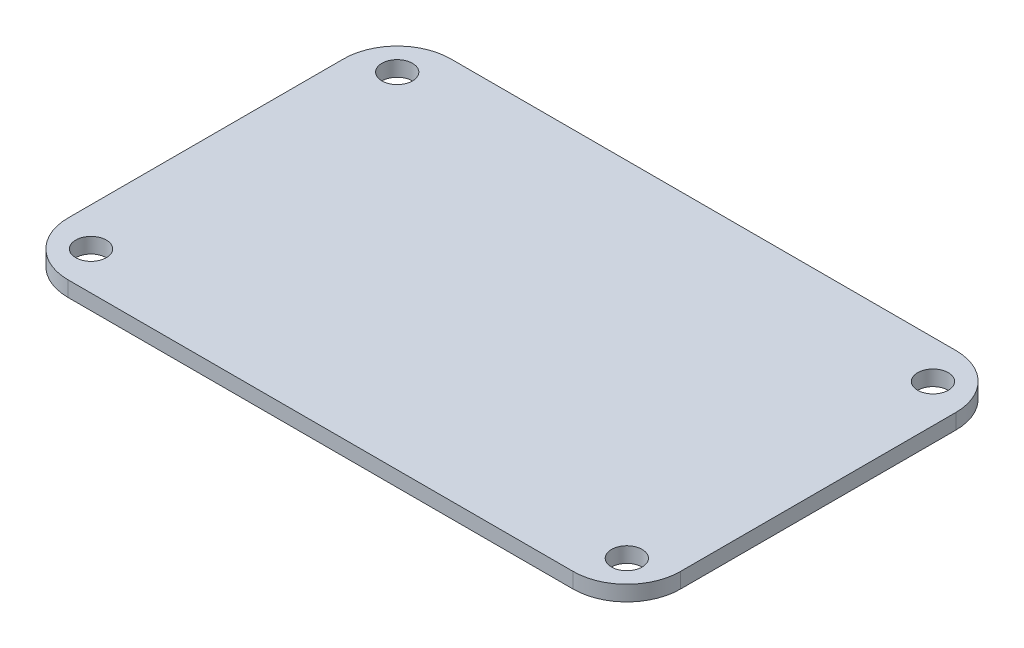
ISO-10303-21;
HEADER;
FILE_DESCRIPTION(('STEP AP214'),'2;1');
FILE_NAME('part.step','',(''),(''),'','','');
FILE_SCHEMA(('AUTOMOTIVE_DESIGN { 1 0 10303 214 1 1 1 1 }'));
ENDSEC;
DATA;
#1=APPLICATION_CONTEXT('core data for automotive mechanical design processes');
#2=APPLICATION_PROTOCOL_DEFINITION('international standard','automotive_design',2000,#1);
#3=PRODUCT_CONTEXT('',#1,'mechanical');
#4=PRODUCT('Part','Part','',(#3));
#5=PRODUCT_RELATED_PRODUCT_CATEGORY('part','',(#4));
#6=PRODUCT_DEFINITION_FORMATION('','',#4);
#7=PRODUCT_DEFINITION_CONTEXT('part definition',#1,'design');
#8=PRODUCT_DEFINITION('design','',#6,#7);
#9=PRODUCT_DEFINITION_SHAPE('','',#8);
#10=(LENGTH_UNIT() NAMED_UNIT(*) SI_UNIT(.MILLI.,.METRE.));
#11=(NAMED_UNIT(*) PLANE_ANGLE_UNIT() SI_UNIT($,.RADIAN.));
#12=(NAMED_UNIT(*) SI_UNIT($,.STERADIAN.) SOLID_ANGLE_UNIT());
#13=UNCERTAINTY_MEASURE_WITH_UNIT(LENGTH_MEASURE(1.E-05),#10,'distance_accuracy_value','');
#14=(GEOMETRIC_REPRESENTATION_CONTEXT(3) GLOBAL_UNCERTAINTY_ASSIGNED_CONTEXT((#13)) GLOBAL_UNIT_ASSIGNED_CONTEXT((#10,
#11,#12)) REPRESENTATION_CONTEXT('',''));
#15=CARTESIAN_POINT('',(0.,0.,0.));
#16=DIRECTION('',(0.,0.,1.));
#17=DIRECTION('',(1.,0.,0.));
#18=AXIS2_PLACEMENT_3D('',#15,#16,#17);
#19=CARTESIAN_POINT('',(40.,2.,-25.));
#20=DIRECTION('',(-1.,0.,0.));
#21=DIRECTION('',(0.,0.,1.));
#22=AXIS2_PLACEMENT_3D('',#19,#20,#21);
#23=PLANE('',#22);
#24=DIRECTION('',(0.,0.,-1.));
#25=VECTOR('',#24,1.);
#26=CARTESIAN_POINT('',(40.,0.,-25.));
#27=LINE('',#26,#25);
#28=CARTESIAN_POINT('',(40.,0.,18.));
#29=VERTEX_POINT('',#28);
#30=CARTESIAN_POINT('',(40.,0.,-18.));
#31=VERTEX_POINT('',#30);
#32=EDGE_CURVE('E159',#29,#31,#27,.T.);
#33=ORIENTED_EDGE('',*,*,#32,.T.);
#34=DIRECTION('',(0.,-1.,0.));
#35=VECTOR('',#34,1.);
#36=CARTESIAN_POINT('',(40.,2.,-18.));
#37=LINE('',#36,#35);
#38=CARTESIAN_POINT('',(40.,2.,-18.));
#39=VERTEX_POINT('',#38);
#40=EDGE_CURVE('E11',#31,#39,#37,.F.);
#41=ORIENTED_EDGE('',*,*,#40,.T.);
#42=DIRECTION('',(0.,0.,-1.));
#43=VECTOR('',#42,1.);
#44=CARTESIAN_POINT('',(40.,2.,-25.));
#45=LINE('',#44,#43);
#46=CARTESIAN_POINT('',(40.,2.,18.));
#47=VERTEX_POINT('',#46);
#48=EDGE_CURVE('E127',#47,#39,#45,.T.);
#49=ORIENTED_EDGE('',*,*,#48,.F.);
#50=DIRECTION('',(0.,-1.,0.));
#51=VECTOR('',#50,1.);
#52=CARTESIAN_POINT('',(40.,2.,18.));
#53=LINE('',#52,#51);
#54=EDGE_CURVE('E43',#47,#29,#53,.T.);
#55=ORIENTED_EDGE('',*,*,#54,.T.);
#56=EDGE_LOOP('',(#33,#41,#49,#55));
#57=FACE_BOUND('',#56,.T.);
#58=ADVANCED_FACE('F35',(#57),#23,.F.);
#59=CARTESIAN_POINT('',(-40.,2.,-25.));
#60=DIRECTION('',(0.,0.,1.));
#61=DIRECTION('',(1.,0.,0.));
#62=AXIS2_PLACEMENT_3D('',#59,#60,#61);
#63=PLANE('',#62);
#64=DIRECTION('',(-1.,0.,0.));
#65=VECTOR('',#64,1.);
#66=CARTESIAN_POINT('',(-40.,0.,-25.));
#67=LINE('',#66,#65);
#68=CARTESIAN_POINT('',(33.,0.,-25.));
#69=VERTEX_POINT('',#68);
#70=CARTESIAN_POINT('',(-33.,0.,-25.));
#71=VERTEX_POINT('',#70);
#72=EDGE_CURVE('E132',#69,#71,#67,.T.);
#73=ORIENTED_EDGE('',*,*,#72,.T.);
#74=DIRECTION('',(0.,-1.,0.));
#75=VECTOR('',#74,1.);
#76=CARTESIAN_POINT('',(-33.,2.,-25.));
#77=LINE('',#76,#75);
#78=CARTESIAN_POINT('',(-33.,2.,-25.));
#79=VERTEX_POINT('',#78);
#80=EDGE_CURVE('E50',#71,#79,#77,.F.);
#81=ORIENTED_EDGE('',*,*,#80,.T.);
#82=DIRECTION('',(-1.,0.,0.));
#83=VECTOR('',#82,1.);
#84=CARTESIAN_POINT('',(-40.,2.,-25.));
#85=LINE('',#84,#83);
#86=CARTESIAN_POINT('',(33.,2.,-25.));
#87=VERTEX_POINT('',#86);
#88=EDGE_CURVE('E130',#87,#79,#85,.T.);
#89=ORIENTED_EDGE('',*,*,#88,.F.);
#90=DIRECTION('',(0.,-1.,0.));
#91=VECTOR('',#90,1.);
#92=CARTESIAN_POINT('',(33.,2.,-25.));
#93=LINE('',#92,#91);
#94=EDGE_CURVE('E151',#87,#69,#93,.T.);
#95=ORIENTED_EDGE('',*,*,#94,.T.);
#96=EDGE_LOOP('',(#73,#81,#89,#95));
#97=FACE_BOUND('',#96,.T.);
#98=ADVANCED_FACE('F222',(#97),#63,.F.);
#99=CARTESIAN_POINT('',(-40.,2.,-25.));
#100=DIRECTION('',(1.,0.,0.));
#101=DIRECTION('',(0.,0.,-1.));
#102=AXIS2_PLACEMENT_3D('',#99,#100,#101);
#103=PLANE('',#102);
#104=DIRECTION('',(0.,0.,1.));
#105=VECTOR('',#104,1.);
#106=CARTESIAN_POINT('',(-40.,0.,-25.));
#107=LINE('',#106,#105);
#108=CARTESIAN_POINT('',(-40.,0.,-18.));
#109=VERTEX_POINT('',#108);
#110=CARTESIAN_POINT('',(-40.,0.,18.));
#111=VERTEX_POINT('',#110);
#112=EDGE_CURVE('E128',#109,#111,#107,.T.);
#113=ORIENTED_EDGE('',*,*,#112,.T.);
#114=DIRECTION('',(0.,-1.,0.));
#115=VECTOR('',#114,1.);
#116=CARTESIAN_POINT('',(-40.,2.,18.));
#117=LINE('',#116,#115);
#118=CARTESIAN_POINT('',(-40.,2.,18.));
#119=VERTEX_POINT('',#118);
#120=EDGE_CURVE('E106',#111,#119,#117,.F.);
#121=ORIENTED_EDGE('',*,*,#120,.T.);
#122=DIRECTION('',(0.,0.,1.));
#123=VECTOR('',#122,1.);
#124=CARTESIAN_POINT('',(-40.,2.,-25.));
#125=LINE('',#124,#123);
#126=CARTESIAN_POINT('',(-40.,2.,-18.));
#127=VERTEX_POINT('',#126);
#128=EDGE_CURVE('E171',#127,#119,#125,.T.);
#129=ORIENTED_EDGE('',*,*,#128,.F.);
#130=DIRECTION('',(0.,-1.,0.));
#131=VECTOR('',#130,1.);
#132=CARTESIAN_POINT('',(-40.,2.,-18.));
#133=LINE('',#132,#131);
#134=EDGE_CURVE('E111',#127,#109,#133,.T.);
#135=ORIENTED_EDGE('',*,*,#134,.T.);
#136=EDGE_LOOP('',(#113,#121,#129,#135));
#137=FACE_BOUND('',#136,.T.);
#138=ADVANCED_FACE('F219',(#137),#103,.F.);
#139=CARTESIAN_POINT('',(-40.,2.,25.));
#140=DIRECTION('',(0.,0.,-1.));
#141=DIRECTION('',(-1.,0.,0.));
#142=AXIS2_PLACEMENT_3D('',#139,#140,#141);
#143=PLANE('',#142);
#144=DIRECTION('',(1.,0.,0.));
#145=VECTOR('',#144,1.);
#146=CARTESIAN_POINT('',(-40.,2.,25.));
#147=LINE('',#146,#145);
#148=CARTESIAN_POINT('',(-33.,2.,25.));
#149=VERTEX_POINT('',#148);
#150=CARTESIAN_POINT('',(33.,2.,25.));
#151=VERTEX_POINT('',#150);
#152=EDGE_CURVE('E121',#149,#151,#147,.T.);
#153=ORIENTED_EDGE('',*,*,#152,.F.);
#154=DIRECTION('',(0.,-1.,0.));
#155=VECTOR('',#154,1.);
#156=CARTESIAN_POINT('',(-33.,2.,25.));
#157=LINE('',#156,#155);
#158=CARTESIAN_POINT('',(-33.,0.,25.));
#159=VERTEX_POINT('',#158);
#160=EDGE_CURVE('E105',#149,#159,#157,.T.);
#161=ORIENTED_EDGE('',*,*,#160,.T.);
#162=DIRECTION('',(1.,0.,0.));
#163=VECTOR('',#162,1.);
#164=CARTESIAN_POINT('',(-40.,0.,25.));
#165=LINE('',#164,#163);
#166=CARTESIAN_POINT('',(33.,0.,25.));
#167=VERTEX_POINT('',#166);
#168=EDGE_CURVE('E118',#159,#167,#165,.T.);
#169=ORIENTED_EDGE('',*,*,#168,.T.);
#170=DIRECTION('',(0.,-1.,0.));
#171=VECTOR('',#170,1.);
#172=CARTESIAN_POINT('',(33.,2.,25.));
#173=LINE('',#172,#171);
#174=EDGE_CURVE('E123',#167,#151,#173,.F.);
#175=ORIENTED_EDGE('',*,*,#174,.T.);
#176=EDGE_LOOP('',(#153,#161,#169,#175));
#177=FACE_BOUND('',#176,.T.);
#178=ADVANCED_FACE('F117',(#177),#143,.F.);
#179=CARTESIAN_POINT('',(0.,2.,0.));
#180=DIRECTION('',(0.,1.,0.));
#181=DIRECTION('',(0.,0.,1.));
#182=AXIS2_PLACEMENT_3D('',#179,#180,#181);
#183=PLANE('',#182);
#184=CARTESIAN_POINT('',(-34.9999999999999,2.,20.0000000000001));
#185=DIRECTION('',(0.,1.,0.));
#186=DIRECTION('',(0.,0.,1.));
#187=AXIS2_PLACEMENT_3D('',#184,#185,#186);
#188=CIRCLE('',#187,2.);
#189=CARTESIAN_POINT('',(-34.9999999999999,2.,18.0000000000001));
#190=VERTEX_POINT('',#189);
#191=EDGE_CURVE('E178',#190,#190,#188,.F.);
#192=ORIENTED_EDGE('',*,*,#191,.T.);
#193=EDGE_LOOP('',(#192));
#194=FACE_BOUND('',#193,.T.);
#195=CARTESIAN_POINT('',(35.0000000000001,2.,20.0000000000001));
#196=DIRECTION('',(0.,1.,0.));
#197=DIRECTION('',(0.,0.,1.));
#198=AXIS2_PLACEMENT_3D('',#195,#196,#197);
#199=CIRCLE('',#198,2.);
#200=CARTESIAN_POINT('',(35.0000000000001,2.,18.0000000000001));
#201=VERTEX_POINT('',#200);
#202=EDGE_CURVE('E185',#201,#201,#199,.F.);
#203=ORIENTED_EDGE('',*,*,#202,.T.);
#204=EDGE_LOOP('',(#203));
#205=FACE_BOUND('',#204,.T.);
#206=CARTESIAN_POINT('',(35.0000000000001,2.,-19.9999999999999));
#207=DIRECTION('',(0.,1.,0.));
#208=DIRECTION('',(0.,0.,1.));
#209=AXIS2_PLACEMENT_3D('',#206,#207,#208);
#210=CIRCLE('',#209,2.);
#211=CARTESIAN_POINT('',(35.0000000000001,2.,-21.9999999999999));
#212=VERTEX_POINT('',#211);
#213=EDGE_CURVE('E177',#212,#212,#210,.F.);
#214=ORIENTED_EDGE('',*,*,#213,.T.);
#215=EDGE_LOOP('',(#214));
#216=FACE_BOUND('',#215,.T.);
#217=CARTESIAN_POINT('',(-34.9999999999999,2.,-19.9999999999999));
#218=DIRECTION('',(0.,1.,0.));
#219=DIRECTION('',(0.,0.,1.));
#220=AXIS2_PLACEMENT_3D('',#217,#218,#219);
#221=CIRCLE('',#220,2.);
#222=CARTESIAN_POINT('',(-34.9999999999999,2.,-21.9999999999999));
#223=VERTEX_POINT('',#222);
#224=EDGE_CURVE('E164',#223,#223,#221,.F.);
#225=ORIENTED_EDGE('',*,*,#224,.T.);
#226=EDGE_LOOP('',(#225));
#227=FACE_BOUND('',#226,.T.);
#228=ORIENTED_EDGE('',*,*,#128,.T.);
#229=CARTESIAN_POINT('',(-33.,2.,18.));
#230=DIRECTION('',(0.,1.,0.));
#231=DIRECTION('',(0.,0.,1.));
#232=AXIS2_PLACEMENT_3D('',#229,#230,#231);
#233=CIRCLE('',#232,7.);
#234=EDGE_CURVE('E149',#119,#149,#233,.T.);
#235=ORIENTED_EDGE('',*,*,#234,.T.);
#236=ORIENTED_EDGE('',*,*,#152,.T.);
#237=CARTESIAN_POINT('',(33.,2.,18.));
#238=DIRECTION('',(0.,1.,0.));
#239=DIRECTION('',(0.,0.,1.));
#240=AXIS2_PLACEMENT_3D('',#237,#238,#239);
#241=CIRCLE('',#240,7.);
#242=EDGE_CURVE('E144',#151,#47,#241,.T.);
#243=ORIENTED_EDGE('',*,*,#242,.T.);
#244=ORIENTED_EDGE('',*,*,#48,.T.);
#245=CARTESIAN_POINT('',(33.,2.,-18.));
#246=DIRECTION('',(0.,1.,0.));
#247=DIRECTION('',(0.,0.,1.));
#248=AXIS2_PLACEMENT_3D('',#245,#246,#247);
#249=CIRCLE('',#248,7.);
#250=EDGE_CURVE('E57',#39,#87,#249,.T.);
#251=ORIENTED_EDGE('',*,*,#250,.T.);
#252=ORIENTED_EDGE('',*,*,#88,.T.);
#253=CARTESIAN_POINT('',(-33.,2.,-18.));
#254=DIRECTION('',(0.,1.,0.));
#255=DIRECTION('',(0.,0.,1.));
#256=AXIS2_PLACEMENT_3D('',#253,#254,#255);
#257=CIRCLE('',#256,7.);
#258=EDGE_CURVE('E147',#79,#127,#257,.T.);
#259=ORIENTED_EDGE('',*,*,#258,.T.);
#260=EDGE_LOOP('',(#228,#235,#236,#243,#244,#251,#252,#259));
#261=FACE_BOUND('',#260,.T.);
#262=ADVANCED_FACE('F201',(#194,#205,#216,#227,#261),#183,.T.);
#263=CARTESIAN_POINT('',(0.,0.,0.));
#264=DIRECTION('',(0.,1.,0.));
#265=DIRECTION('',(0.,0.,1.));
#266=AXIS2_PLACEMENT_3D('',#263,#264,#265);
#267=PLANE('',#266);
#268=CARTESIAN_POINT('',(-34.9999999999999,0.,20.0000000000001));
#269=DIRECTION('',(0.,-1.,0.));
#270=DIRECTION('',(0.,0.,-1.));
#271=AXIS2_PLACEMENT_3D('',#268,#269,#270);
#272=CIRCLE('',#271,2.);
#273=CARTESIAN_POINT('',(-34.9999999999999,0.,18.0000000000001));
#274=VERTEX_POINT('',#273);
#275=EDGE_CURVE('E182',#274,#274,#272,.T.);
#276=ORIENTED_EDGE('',*,*,#275,.F.);
#277=EDGE_LOOP('',(#276));
#278=FACE_BOUND('',#277,.T.);
#279=CARTESIAN_POINT('',(35.0000000000001,0.,20.0000000000001));
#280=DIRECTION('',(0.,-1.,0.));
#281=DIRECTION('',(0.,0.,-1.));
#282=AXIS2_PLACEMENT_3D('',#279,#280,#281);
#283=CIRCLE('',#282,2.);
#284=CARTESIAN_POINT('',(35.0000000000001,0.,18.0000000000001));
#285=VERTEX_POINT('',#284);
#286=EDGE_CURVE('E181',#285,#285,#283,.T.);
#287=ORIENTED_EDGE('',*,*,#286,.F.);
#288=EDGE_LOOP('',(#287));
#289=FACE_BOUND('',#288,.T.);
#290=CARTESIAN_POINT('',(35.0000000000001,0.,-19.9999999999999));
#291=DIRECTION('',(0.,-1.,0.));
#292=DIRECTION('',(0.,0.,-1.));
#293=AXIS2_PLACEMENT_3D('',#290,#291,#292);
#294=CIRCLE('',#293,2.);
#295=CARTESIAN_POINT('',(35.0000000000001,0.,-21.9999999999999));
#296=VERTEX_POINT('',#295);
#297=EDGE_CURVE('E188',#296,#296,#294,.T.);
#298=ORIENTED_EDGE('',*,*,#297,.F.);
#299=EDGE_LOOP('',(#298));
#300=FACE_BOUND('',#299,.T.);
#301=CARTESIAN_POINT('',(-34.9999999999999,0.,-19.9999999999999));
#302=DIRECTION('',(0.,-1.,0.));
#303=DIRECTION('',(0.,0.,-1.));
#304=AXIS2_PLACEMENT_3D('',#301,#302,#303);
#305=CIRCLE('',#304,2.);
#306=CARTESIAN_POINT('',(-34.9999999999999,0.,-21.9999999999999));
#307=VERTEX_POINT('',#306);
#308=EDGE_CURVE('E167',#307,#307,#305,.T.);
#309=ORIENTED_EDGE('',*,*,#308,.F.);
#310=EDGE_LOOP('',(#309));
#311=FACE_BOUND('',#310,.T.);
#312=ORIENTED_EDGE('',*,*,#168,.F.);
#313=CARTESIAN_POINT('',(-33.,0.,18.));
#314=DIRECTION('',(0.,1.,0.));
#315=DIRECTION('',(0.,0.,1.));
#316=AXIS2_PLACEMENT_3D('',#313,#314,#315);
#317=CIRCLE('',#316,7.);
#318=EDGE_CURVE('E101',#159,#111,#317,.F.);
#319=ORIENTED_EDGE('',*,*,#318,.T.);
#320=ORIENTED_EDGE('',*,*,#112,.F.);
#321=CARTESIAN_POINT('',(-33.,0.,-18.));
#322=DIRECTION('',(0.,1.,0.));
#323=DIRECTION('',(0.,0.,1.));
#324=AXIS2_PLACEMENT_3D('',#321,#322,#323);
#325=CIRCLE('',#324,7.);
#326=EDGE_CURVE('E112',#109,#71,#325,.F.);
#327=ORIENTED_EDGE('',*,*,#326,.T.);
#328=ORIENTED_EDGE('',*,*,#72,.F.);
#329=CARTESIAN_POINT('',(33.,0.,-18.));
#330=DIRECTION('',(0.,1.,0.));
#331=DIRECTION('',(0.,0.,1.));
#332=AXIS2_PLACEMENT_3D('',#329,#330,#331);
#333=CIRCLE('',#332,7.);
#334=EDGE_CURVE('E138',#69,#31,#333,.F.);
#335=ORIENTED_EDGE('',*,*,#334,.T.);
#336=ORIENTED_EDGE('',*,*,#32,.F.);
#337=CARTESIAN_POINT('',(33.,0.,18.));
#338=DIRECTION('',(0.,1.,0.));
#339=DIRECTION('',(0.,0.,1.));
#340=AXIS2_PLACEMENT_3D('',#337,#338,#339);
#341=CIRCLE('',#340,7.);
#342=EDGE_CURVE('E122',#29,#167,#341,.F.);
#343=ORIENTED_EDGE('',*,*,#342,.T.);
#344=EDGE_LOOP('',(#312,#319,#320,#327,#328,#335,#336,#343));
#345=FACE_BOUND('',#344,.T.);
#346=ADVANCED_FACE('F125',(#278,#289,#300,#311,#345),#267,.F.);
#347=CARTESIAN_POINT('',(-33.,2.,18.));
#348=DIRECTION('',(0.,-1.,0.));
#349=DIRECTION('',(0.,0.,-1.));
#350=AXIS2_PLACEMENT_3D('',#347,#348,#349);
#351=CYLINDRICAL_SURFACE('',#350,7.);
#352=ORIENTED_EDGE('',*,*,#234,.F.);
#353=ORIENTED_EDGE('',*,*,#120,.F.);
#354=ORIENTED_EDGE('',*,*,#318,.F.);
#355=ORIENTED_EDGE('',*,*,#160,.F.);
#356=EDGE_LOOP('',(#352,#353,#354,#355));
#357=FACE_BOUND('',#356,.T.);
#358=ADVANCED_FACE('F104',(#357),#351,.T.);
#359=CARTESIAN_POINT('',(-33.,2.,-18.));
#360=DIRECTION('',(0.,-1.,0.));
#361=DIRECTION('',(0.,0.,-1.));
#362=AXIS2_PLACEMENT_3D('',#359,#360,#361);
#363=CYLINDRICAL_SURFACE('',#362,7.);
#364=ORIENTED_EDGE('',*,*,#258,.F.);
#365=ORIENTED_EDGE('',*,*,#80,.F.);
#366=ORIENTED_EDGE('',*,*,#326,.F.);
#367=ORIENTED_EDGE('',*,*,#134,.F.);
#368=EDGE_LOOP('',(#364,#365,#366,#367));
#369=FACE_BOUND('',#368,.T.);
#370=ADVANCED_FACE('F221',(#369),#363,.T.);
#371=CARTESIAN_POINT('',(33.,2.,-18.));
#372=DIRECTION('',(0.,-1.,0.));
#373=DIRECTION('',(0.,0.,-1.));
#374=AXIS2_PLACEMENT_3D('',#371,#372,#373);
#375=CYLINDRICAL_SURFACE('',#374,7.);
#376=ORIENTED_EDGE('',*,*,#250,.F.);
#377=ORIENTED_EDGE('',*,*,#40,.F.);
#378=ORIENTED_EDGE('',*,*,#334,.F.);
#379=ORIENTED_EDGE('',*,*,#94,.F.);
#380=EDGE_LOOP('',(#376,#377,#378,#379));
#381=FACE_BOUND('',#380,.T.);
#382=ADVANCED_FACE('F225',(#381),#375,.T.);
#383=CARTESIAN_POINT('',(33.,2.,18.));
#384=DIRECTION('',(0.,-1.,0.));
#385=DIRECTION('',(0.,0.,-1.));
#386=AXIS2_PLACEMENT_3D('',#383,#384,#385);
#387=CYLINDRICAL_SURFACE('',#386,7.);
#388=ORIENTED_EDGE('',*,*,#242,.F.);
#389=ORIENTED_EDGE('',*,*,#174,.F.);
#390=ORIENTED_EDGE('',*,*,#342,.F.);
#391=ORIENTED_EDGE('',*,*,#54,.F.);
#392=EDGE_LOOP('',(#388,#389,#390,#391));
#393=FACE_BOUND('',#392,.T.);
#394=ADVANCED_FACE('F37',(#393),#387,.T.);
#395=CARTESIAN_POINT('',(-34.9999999999999,7.65685424949238,-19.9999999999999));
#396=DIRECTION('',(0.,-1.,0.));
#397=DIRECTION('',(0.,0.,-1.));
#398=AXIS2_PLACEMENT_3D('',#395,#396,#397);
#399=CYLINDRICAL_SURFACE('',#398,2.);
#400=CARTESIAN_POINT('',(-34.9999999999999,0.,-21.9999999999999));
#401=CARTESIAN_POINT('',(-34.9999999999999,0.0208333333333342,-21.9999999999999));
#402=CARTESIAN_POINT('',(-34.9999999999999,0.0416666666666676,-21.9999999999999));
#403=CARTESIAN_POINT('',(-34.9999999999999,0.0833333333333343,-21.9999999999999));
#404=CARTESIAN_POINT('',(-34.9999999999999,0.104166666666668,-21.9999999999999));
#405=CARTESIAN_POINT('',(-34.9999999999999,0.145833333333334,-21.9999999999999));
#406=CARTESIAN_POINT('',(-34.9999999999999,0.166666666666668,-21.9999999999999));
#407=CARTESIAN_POINT('',(-34.9999999999999,0.208333333333334,-21.9999999999999));
#408=CARTESIAN_POINT('',(-34.9999999999999,0.229166666666668,-21.9999999999999));
#409=CARTESIAN_POINT('',(-34.9999999999999,0.270833333333334,-21.9999999999999));
#410=CARTESIAN_POINT('',(-34.9999999999999,0.291666666666667,-21.9999999999999));
#411=CARTESIAN_POINT('',(-34.9999999999999,0.333333333333334,-21.9999999999999));
#412=CARTESIAN_POINT('',(-34.9999999999999,0.354166666666667,-21.9999999999999));
#413=CARTESIAN_POINT('',(-34.9999999999999,0.395833333333334,-21.9999999999999));
#414=CARTESIAN_POINT('',(-34.9999999999999,0.416666666666667,-21.9999999999999));
#415=CARTESIAN_POINT('',(-34.9999999999999,0.458333333333334,-21.9999999999999));
#416=CARTESIAN_POINT('',(-34.9999999999999,0.479166666666667,-21.9999999999999));
#417=CARTESIAN_POINT('',(-34.9999999999999,0.520833333333334,-21.9999999999999));
#418=CARTESIAN_POINT('',(-34.9999999999999,0.541666666666667,-21.9999999999999));
#419=CARTESIAN_POINT('',(-34.9999999999999,0.583333333333334,-21.9999999999999));
#420=CARTESIAN_POINT('',(-34.9999999999999,0.604166666666667,-21.9999999999999));
#421=CARTESIAN_POINT('',(-34.9999999999999,0.645833333333334,-21.9999999999999));
#422=CARTESIAN_POINT('',(-34.9999999999999,0.666666666666667,-21.9999999999999));
#423=CARTESIAN_POINT('',(-34.9999999999999,0.708333333333334,-21.9999999999999));
#424=CARTESIAN_POINT('',(-34.9999999999999,0.729166666666667,-21.9999999999999));
#425=CARTESIAN_POINT('',(-34.9999999999999,0.770833333333333,-21.9999999999999));
#426=CARTESIAN_POINT('',(-34.9999999999999,0.791666666666667,-21.9999999999999));
#427=CARTESIAN_POINT('',(-34.9999999999999,0.833333333333333,-21.9999999999999));
#428=CARTESIAN_POINT('',(-34.9999999999999,0.854166666666667,-21.9999999999999));
#429=CARTESIAN_POINT('',(-34.9999999999999,0.895833333333333,-21.9999999999999));
#430=CARTESIAN_POINT('',(-34.9999999999999,0.916666666666667,-21.9999999999999));
#431=CARTESIAN_POINT('',(-34.9999999999999,0.958333333333333,-21.9999999999999));
#432=CARTESIAN_POINT('',(-34.9999999999999,0.979166666666667,-21.9999999999999));
#433=CARTESIAN_POINT('',(-34.9999999999999,1.02083333333333,-21.9999999999999));
#434=CARTESIAN_POINT('',(-34.9999999999999,1.04166666666667,-21.9999999999999));
#435=CARTESIAN_POINT('',(-34.9999999999999,1.08333333333333,-21.9999999999999));
#436=CARTESIAN_POINT('',(-34.9999999999999,1.10416666666667,-21.9999999999999));
#437=CARTESIAN_POINT('',(-34.9999999999999,1.14583333333333,-21.9999999999999));
#438=CARTESIAN_POINT('',(-34.9999999999999,1.16666666666667,-21.9999999999999));
#439=CARTESIAN_POINT('',(-34.9999999999999,1.20833333333333,-21.9999999999999));
#440=CARTESIAN_POINT('',(-34.9999999999999,1.22916666666667,-21.9999999999999));
#441=CARTESIAN_POINT('',(-34.9999999999999,1.27083333333333,-21.9999999999999));
#442=CARTESIAN_POINT('',(-34.9999999999999,1.29166666666667,-21.9999999999999));
#443=CARTESIAN_POINT('',(-34.9999999999999,1.33333333333333,-21.9999999999999));
#444=CARTESIAN_POINT('',(-34.9999999999999,1.35416666666667,-21.9999999999999));
#445=CARTESIAN_POINT('',(-34.9999999999999,1.39583333333333,-21.9999999999999));
#446=CARTESIAN_POINT('',(-34.9999999999999,1.41666666666667,-21.9999999999999));
#447=CARTESIAN_POINT('',(-34.9999999999999,1.45833333333333,-21.9999999999999));
#448=CARTESIAN_POINT('',(-34.9999999999999,1.47916666666667,-21.9999999999999));
#449=CARTESIAN_POINT('',(-34.9999999999999,1.52083333333333,-21.9999999999999));
#450=CARTESIAN_POINT('',(-34.9999999999999,1.54166666666667,-21.9999999999999));
#451=CARTESIAN_POINT('',(-34.9999999999999,1.58333333333333,-21.9999999999999));
#452=CARTESIAN_POINT('',(-34.9999999999999,1.60416666666667,-21.9999999999999));
#453=CARTESIAN_POINT('',(-34.9999999999999,1.64583333333333,-21.9999999999999));
#454=CARTESIAN_POINT('',(-34.9999999999999,1.66666666666667,-21.9999999999999));
#455=CARTESIAN_POINT('',(-34.9999999999999,1.70833333333333,-21.9999999999999));
#456=CARTESIAN_POINT('',(-34.9999999999999,1.72916666666667,-21.9999999999999));
#457=CARTESIAN_POINT('',(-34.9999999999999,1.77083333333333,-21.9999999999999));
#458=CARTESIAN_POINT('',(-34.9999999999999,1.79166666666667,-21.9999999999999));
#459=CARTESIAN_POINT('',(-34.9999999999999,1.83333333333333,-21.9999999999999));
#460=CARTESIAN_POINT('',(-34.9999999999999,1.85416666666667,-21.9999999999999));
#461=CARTESIAN_POINT('',(-34.9999999999999,1.89583333333333,-21.9999999999999));
#462=CARTESIAN_POINT('',(-34.9999999999999,1.91666666666667,-21.9999999999999));
#463=CARTESIAN_POINT('',(-34.9999999999999,1.95833333333333,-21.9999999999999));
#464=CARTESIAN_POINT('',(-34.9999999999999,1.97916666666667,-21.9999999999999));
#465=CARTESIAN_POINT('',(-34.9999999999999,2.,-21.9999999999999));
#466=B_SPLINE_CURVE_WITH_KNOTS('',3,(#400,#401,#402,#403,#404,#405,#406,#407,#408,#409,#410,
#411,#412,#413,#414,#415,#416,#417,#418,#419,#420,#421,#422,#423,#424,#425,#426,#427,#428,#429,
#430,#431,#432,#433,#434,#435,#436,#437,#438,#439,#440,#441,#442,#443,#444,#445,#446,#447,#448,
#449,#450,#451,#452,#453,#454,#455,#456,#457,#458,#459,#460,#461,#462,#463,#464,#465),
.UNSPECIFIED.,.F.,.F.,(4,2,2,2,2,2,2,2,2,2,2,2,2,2,2,2,2,2,2,2,2,2,2,2,2,2,2,2,2,2,2,2,4),(0.,
0.0625000000000001,0.125,0.1875,0.25,0.312499999999999,0.374999999999999,0.4375,0.5,0.5625,
0.625,0.6875,0.749999999999999,0.812499999999999,0.874999999999999,0.937499999999999,
0.999999999999999,1.0625,1.125,1.1875,1.25,1.3125,1.375,1.4375,1.5,1.5625,1.625,1.6875,1.75,
1.8125,1.875,1.9375,2.),.UNSPECIFIED.);
#467=EDGE_CURVE('BSEAM206',#307,#223,#466,.T.);
#468=ORIENTED_EDGE('',*,*,#308,.T.);
#469=ORIENTED_EDGE('',*,*,#224,.F.);
#470=ORIENTED_EDGE('',*,*,#467,.T.);
#471=ORIENTED_EDGE('',*,*,#467,.F.);
#472=EDGE_LOOP('',(#468,#470,#469,#471));
#473=FACE_BOUND('',#472,.T.);
#474=ADVANCED_FACE('F206',(#473),#399,.F.);
#475=CARTESIAN_POINT('',(35.0000000000001,7.65685424949238,-19.9999999999999));
#476=DIRECTION('',(0.,-1.,0.));
#477=DIRECTION('',(0.,0.,-1.));
#478=AXIS2_PLACEMENT_3D('',#475,#476,#477);
#479=CYLINDRICAL_SURFACE('',#478,2.);
#480=CARTESIAN_POINT('',(35.0000000000001,0.,-21.9999999999999));
#481=CARTESIAN_POINT('',(35.0000000000001,0.0208333333333342,-21.9999999999999));
#482=CARTESIAN_POINT('',(35.0000000000001,0.0416666666666676,-21.9999999999999));
#483=CARTESIAN_POINT('',(35.0000000000001,0.0833333333333343,-21.9999999999999));
#484=CARTESIAN_POINT('',(35.0000000000001,0.104166666666668,-21.9999999999999));
#485=CARTESIAN_POINT('',(35.0000000000001,0.145833333333334,-21.9999999999999));
#486=CARTESIAN_POINT('',(35.0000000000001,0.166666666666668,-21.9999999999999));
#487=CARTESIAN_POINT('',(35.0000000000001,0.208333333333334,-21.9999999999999));
#488=CARTESIAN_POINT('',(35.0000000000001,0.229166666666668,-21.9999999999999));
#489=CARTESIAN_POINT('',(35.0000000000001,0.270833333333334,-21.9999999999999));
#490=CARTESIAN_POINT('',(35.0000000000001,0.291666666666667,-21.9999999999999));
#491=CARTESIAN_POINT('',(35.0000000000001,0.333333333333334,-21.9999999999999));
#492=CARTESIAN_POINT('',(35.0000000000001,0.354166666666667,-21.9999999999999));
#493=CARTESIAN_POINT('',(35.0000000000001,0.395833333333334,-21.9999999999999));
#494=CARTESIAN_POINT('',(35.0000000000001,0.416666666666667,-21.9999999999999));
#495=CARTESIAN_POINT('',(35.0000000000001,0.458333333333334,-21.9999999999999));
#496=CARTESIAN_POINT('',(35.0000000000001,0.479166666666667,-21.9999999999999));
#497=CARTESIAN_POINT('',(35.0000000000001,0.520833333333334,-21.9999999999999));
#498=CARTESIAN_POINT('',(35.0000000000001,0.541666666666667,-21.9999999999999));
#499=CARTESIAN_POINT('',(35.0000000000001,0.583333333333334,-21.9999999999999));
#500=CARTESIAN_POINT('',(35.0000000000001,0.604166666666667,-21.9999999999999));
#501=CARTESIAN_POINT('',(35.0000000000001,0.645833333333334,-21.9999999999999));
#502=CARTESIAN_POINT('',(35.0000000000001,0.666666666666667,-21.9999999999999));
#503=CARTESIAN_POINT('',(35.0000000000001,0.708333333333334,-21.9999999999999));
#504=CARTESIAN_POINT('',(35.0000000000001,0.729166666666667,-21.9999999999999));
#505=CARTESIAN_POINT('',(35.0000000000001,0.770833333333333,-21.9999999999999));
#506=CARTESIAN_POINT('',(35.0000000000001,0.791666666666667,-21.9999999999999));
#507=CARTESIAN_POINT('',(35.0000000000001,0.833333333333333,-21.9999999999999));
#508=CARTESIAN_POINT('',(35.0000000000001,0.854166666666667,-21.9999999999999));
#509=CARTESIAN_POINT('',(35.0000000000001,0.895833333333333,-21.9999999999999));
#510=CARTESIAN_POINT('',(35.0000000000001,0.916666666666667,-21.9999999999999));
#511=CARTESIAN_POINT('',(35.0000000000001,0.958333333333333,-21.9999999999999));
#512=CARTESIAN_POINT('',(35.0000000000001,0.979166666666667,-21.9999999999999));
#513=CARTESIAN_POINT('',(35.0000000000001,1.02083333333333,-21.9999999999999));
#514=CARTESIAN_POINT('',(35.0000000000001,1.04166666666667,-21.9999999999999));
#515=CARTESIAN_POINT('',(35.0000000000001,1.08333333333333,-21.9999999999999));
#516=CARTESIAN_POINT('',(35.0000000000001,1.10416666666667,-21.9999999999999));
#517=CARTESIAN_POINT('',(35.0000000000001,1.14583333333333,-21.9999999999999));
#518=CARTESIAN_POINT('',(35.0000000000001,1.16666666666667,-21.9999999999999));
#519=CARTESIAN_POINT('',(35.0000000000001,1.20833333333333,-21.9999999999999));
#520=CARTESIAN_POINT('',(35.0000000000001,1.22916666666667,-21.9999999999999));
#521=CARTESIAN_POINT('',(35.0000000000001,1.27083333333333,-21.9999999999999));
#522=CARTESIAN_POINT('',(35.0000000000001,1.29166666666667,-21.9999999999999));
#523=CARTESIAN_POINT('',(35.0000000000001,1.33333333333333,-21.9999999999999));
#524=CARTESIAN_POINT('',(35.0000000000001,1.35416666666667,-21.9999999999999));
#525=CARTESIAN_POINT('',(35.0000000000001,1.39583333333333,-21.9999999999999));
#526=CARTESIAN_POINT('',(35.0000000000001,1.41666666666667,-21.9999999999999));
#527=CARTESIAN_POINT('',(35.0000000000001,1.45833333333333,-21.9999999999999));
#528=CARTESIAN_POINT('',(35.0000000000001,1.47916666666667,-21.9999999999999));
#529=CARTESIAN_POINT('',(35.0000000000001,1.52083333333333,-21.9999999999999));
#530=CARTESIAN_POINT('',(35.0000000000001,1.54166666666667,-21.9999999999999));
#531=CARTESIAN_POINT('',(35.0000000000001,1.58333333333333,-21.9999999999999));
#532=CARTESIAN_POINT('',(35.0000000000001,1.60416666666667,-21.9999999999999));
#533=CARTESIAN_POINT('',(35.0000000000001,1.64583333333333,-21.9999999999999));
#534=CARTESIAN_POINT('',(35.0000000000001,1.66666666666667,-21.9999999999999));
#535=CARTESIAN_POINT('',(35.0000000000001,1.70833333333333,-21.9999999999999));
#536=CARTESIAN_POINT('',(35.0000000000001,1.72916666666667,-21.9999999999999));
#537=CARTESIAN_POINT('',(35.0000000000001,1.77083333333333,-21.9999999999999));
#538=CARTESIAN_POINT('',(35.0000000000001,1.79166666666667,-21.9999999999999));
#539=CARTESIAN_POINT('',(35.0000000000001,1.83333333333333,-21.9999999999999));
#540=CARTESIAN_POINT('',(35.0000000000001,1.85416666666667,-21.9999999999999));
#541=CARTESIAN_POINT('',(35.0000000000001,1.89583333333333,-21.9999999999999));
#542=CARTESIAN_POINT('',(35.0000000000001,1.91666666666667,-21.9999999999999));
#543=CARTESIAN_POINT('',(35.0000000000001,1.95833333333333,-21.9999999999999));
#544=CARTESIAN_POINT('',(35.0000000000001,1.97916666666667,-21.9999999999999));
#545=CARTESIAN_POINT('',(35.0000000000001,2.,-21.9999999999999));
#546=B_SPLINE_CURVE_WITH_KNOTS('',3,(#480,#481,#482,#483,#484,#485,#486,#487,#488,#489,#490,
#491,#492,#493,#494,#495,#496,#497,#498,#499,#500,#501,#502,#503,#504,#505,#506,#507,#508,#509,
#510,#511,#512,#513,#514,#515,#516,#517,#518,#519,#520,#521,#522,#523,#524,#525,#526,#527,#528,
#529,#530,#531,#532,#533,#534,#535,#536,#537,#538,#539,#540,#541,#542,#543,#544,#545),
.UNSPECIFIED.,.F.,.F.,(4,2,2,2,2,2,2,2,2,2,2,2,2,2,2,2,2,2,2,2,2,2,2,2,2,2,2,2,2,2,2,2,4),(0.,
0.0625000000000001,0.125,0.1875,0.25,0.312499999999999,0.374999999999999,0.4375,0.5,0.5625,
0.625,0.6875,0.749999999999999,0.812499999999999,0.874999999999999,0.937499999999999,
0.999999999999999,1.0625,1.125,1.1875,1.25,1.3125,1.375,1.4375,1.5,1.5625,1.625,1.6875,1.75,
1.8125,1.875,1.9375,2.),.UNSPECIFIED.);
#547=EDGE_CURVE('BSEAM196',#296,#212,#546,.T.);
#548=ORIENTED_EDGE('',*,*,#297,.T.);
#549=ORIENTED_EDGE('',*,*,#213,.F.);
#550=ORIENTED_EDGE('',*,*,#547,.T.);
#551=ORIENTED_EDGE('',*,*,#547,.F.);
#552=EDGE_LOOP('',(#548,#550,#549,#551));
#553=FACE_BOUND('',#552,.T.);
#554=ADVANCED_FACE('F196',(#553),#479,.F.);
#555=CARTESIAN_POINT('',(35.0000000000001,7.65685424949238,20.0000000000001));
#556=DIRECTION('',(0.,-1.,0.));
#557=DIRECTION('',(0.,0.,-1.));
#558=AXIS2_PLACEMENT_3D('',#555,#556,#557);
#559=CYLINDRICAL_SURFACE('',#558,2.);
#560=CARTESIAN_POINT('',(35.0000000000001,0.,18.0000000000001));
#561=CARTESIAN_POINT('',(35.0000000000001,0.0208333333333342,18.0000000000001));
#562=CARTESIAN_POINT('',(35.0000000000001,0.0416666666666676,18.0000000000001));
#563=CARTESIAN_POINT('',(35.0000000000001,0.0833333333333343,18.0000000000001));
#564=CARTESIAN_POINT('',(35.0000000000001,0.104166666666668,18.0000000000001));
#565=CARTESIAN_POINT('',(35.0000000000001,0.145833333333334,18.0000000000001));
#566=CARTESIAN_POINT('',(35.0000000000001,0.166666666666668,18.0000000000001));
#567=CARTESIAN_POINT('',(35.0000000000001,0.208333333333334,18.0000000000001));
#568=CARTESIAN_POINT('',(35.0000000000001,0.229166666666668,18.0000000000001));
#569=CARTESIAN_POINT('',(35.0000000000001,0.270833333333334,18.0000000000001));
#570=CARTESIAN_POINT('',(35.0000000000001,0.291666666666667,18.0000000000001));
#571=CARTESIAN_POINT('',(35.0000000000001,0.333333333333334,18.0000000000001));
#572=CARTESIAN_POINT('',(35.0000000000001,0.354166666666667,18.0000000000001));
#573=CARTESIAN_POINT('',(35.0000000000001,0.395833333333334,18.0000000000001));
#574=CARTESIAN_POINT('',(35.0000000000001,0.416666666666667,18.0000000000001));
#575=CARTESIAN_POINT('',(35.0000000000001,0.458333333333334,18.0000000000001));
#576=CARTESIAN_POINT('',(35.0000000000001,0.479166666666667,18.0000000000001));
#577=CARTESIAN_POINT('',(35.0000000000001,0.520833333333334,18.0000000000001));
#578=CARTESIAN_POINT('',(35.0000000000001,0.541666666666667,18.0000000000001));
#579=CARTESIAN_POINT('',(35.0000000000001,0.583333333333334,18.0000000000001));
#580=CARTESIAN_POINT('',(35.0000000000001,0.604166666666667,18.0000000000001));
#581=CARTESIAN_POINT('',(35.0000000000001,0.645833333333334,18.0000000000001));
#582=CARTESIAN_POINT('',(35.0000000000001,0.666666666666667,18.0000000000001));
#583=CARTESIAN_POINT('',(35.0000000000001,0.708333333333334,18.0000000000001));
#584=CARTESIAN_POINT('',(35.0000000000001,0.729166666666667,18.0000000000001));
#585=CARTESIAN_POINT('',(35.0000000000001,0.770833333333333,18.0000000000001));
#586=CARTESIAN_POINT('',(35.0000000000001,0.791666666666667,18.0000000000001));
#587=CARTESIAN_POINT('',(35.0000000000001,0.833333333333333,18.0000000000001));
#588=CARTESIAN_POINT('',(35.0000000000001,0.854166666666667,18.0000000000001));
#589=CARTESIAN_POINT('',(35.0000000000001,0.895833333333333,18.0000000000001));
#590=CARTESIAN_POINT('',(35.0000000000001,0.916666666666667,18.0000000000001));
#591=CARTESIAN_POINT('',(35.0000000000001,0.958333333333333,18.0000000000001));
#592=CARTESIAN_POINT('',(35.0000000000001,0.979166666666667,18.0000000000001));
#593=CARTESIAN_POINT('',(35.0000000000001,1.02083333333333,18.0000000000001));
#594=CARTESIAN_POINT('',(35.0000000000001,1.04166666666667,18.0000000000001));
#595=CARTESIAN_POINT('',(35.0000000000001,1.08333333333333,18.0000000000001));
#596=CARTESIAN_POINT('',(35.0000000000001,1.10416666666667,18.0000000000001));
#597=CARTESIAN_POINT('',(35.0000000000001,1.14583333333333,18.0000000000001));
#598=CARTESIAN_POINT('',(35.0000000000001,1.16666666666667,18.0000000000001));
#599=CARTESIAN_POINT('',(35.0000000000001,1.20833333333333,18.0000000000001));
#600=CARTESIAN_POINT('',(35.0000000000001,1.22916666666667,18.0000000000001));
#601=CARTESIAN_POINT('',(35.0000000000001,1.27083333333333,18.0000000000001));
#602=CARTESIAN_POINT('',(35.0000000000001,1.29166666666667,18.0000000000001));
#603=CARTESIAN_POINT('',(35.0000000000001,1.33333333333333,18.0000000000001));
#604=CARTESIAN_POINT('',(35.0000000000001,1.35416666666667,18.0000000000001));
#605=CARTESIAN_POINT('',(35.0000000000001,1.39583333333333,18.0000000000001));
#606=CARTESIAN_POINT('',(35.0000000000001,1.41666666666667,18.0000000000001));
#607=CARTESIAN_POINT('',(35.0000000000001,1.45833333333333,18.0000000000001));
#608=CARTESIAN_POINT('',(35.0000000000001,1.47916666666667,18.0000000000001));
#609=CARTESIAN_POINT('',(35.0000000000001,1.52083333333333,18.0000000000001));
#610=CARTESIAN_POINT('',(35.0000000000001,1.54166666666667,18.0000000000001));
#611=CARTESIAN_POINT('',(35.0000000000001,1.58333333333333,18.0000000000001));
#612=CARTESIAN_POINT('',(35.0000000000001,1.60416666666667,18.0000000000001));
#613=CARTESIAN_POINT('',(35.0000000000001,1.64583333333333,18.0000000000001));
#614=CARTESIAN_POINT('',(35.0000000000001,1.66666666666667,18.0000000000001));
#615=CARTESIAN_POINT('',(35.0000000000001,1.70833333333333,18.0000000000001));
#616=CARTESIAN_POINT('',(35.0000000000001,1.72916666666667,18.0000000000001));
#617=CARTESIAN_POINT('',(35.0000000000001,1.77083333333333,18.0000000000001));
#618=CARTESIAN_POINT('',(35.0000000000001,1.79166666666667,18.0000000000001));
#619=CARTESIAN_POINT('',(35.0000000000001,1.83333333333333,18.0000000000001));
#620=CARTESIAN_POINT('',(35.0000000000001,1.85416666666667,18.0000000000001));
#621=CARTESIAN_POINT('',(35.0000000000001,1.89583333333333,18.0000000000001));
#622=CARTESIAN_POINT('',(35.0000000000001,1.91666666666667,18.0000000000001));
#623=CARTESIAN_POINT('',(35.0000000000001,1.95833333333333,18.0000000000001));
#624=CARTESIAN_POINT('',(35.0000000000001,1.97916666666667,18.0000000000001));
#625=CARTESIAN_POINT('',(35.0000000000001,2.,18.0000000000001));
#626=B_SPLINE_CURVE_WITH_KNOTS('',3,(#560,#561,#562,#563,#564,#565,#566,#567,#568,#569,#570,
#571,#572,#573,#574,#575,#576,#577,#578,#579,#580,#581,#582,#583,#584,#585,#586,#587,#588,#589,
#590,#591,#592,#593,#594,#595,#596,#597,#598,#599,#600,#601,#602,#603,#604,#605,#606,#607,#608,
#609,#610,#611,#612,#613,#614,#615,#616,#617,#618,#619,#620,#621,#622,#623,#624,#625),
.UNSPECIFIED.,.F.,.F.,(4,2,2,2,2,2,2,2,2,2,2,2,2,2,2,2,2,2,2,2,2,2,2,2,2,2,2,2,2,2,2,2,4),(0.,
0.0625000000000001,0.125,0.1875,0.25,0.312499999999999,0.374999999999999,0.4375,0.5,0.5625,
0.625,0.6875,0.749999999999999,0.812499999999999,0.874999999999999,0.937499999999999,
0.999999999999999,1.0625,1.125,1.1875,1.25,1.3125,1.375,1.4375,1.5,1.5625,1.625,1.6875,1.75,
1.8125,1.875,1.9375,2.),.UNSPECIFIED.);
#627=EDGE_CURVE('BSEAM285',#285,#201,#626,.T.);
#628=ORIENTED_EDGE('',*,*,#286,.T.);
#629=ORIENTED_EDGE('',*,*,#202,.F.);
#630=ORIENTED_EDGE('',*,*,#627,.T.);
#631=ORIENTED_EDGE('',*,*,#627,.F.);
#632=EDGE_LOOP('',(#628,#630,#629,#631));
#633=FACE_BOUND('',#632,.T.);
#634=ADVANCED_FACE('F285',(#633),#559,.F.);
#635=CARTESIAN_POINT('',(-34.9999999999999,7.65685424949238,20.0000000000001));
#636=DIRECTION('',(0.,-1.,0.));
#637=DIRECTION('',(0.,0.,-1.));
#638=AXIS2_PLACEMENT_3D('',#635,#636,#637);
#639=CYLINDRICAL_SURFACE('',#638,2.);
#640=CARTESIAN_POINT('',(-34.9999999999999,0.,18.0000000000001));
#641=CARTESIAN_POINT('',(-34.9999999999999,0.0208333333333342,18.0000000000001));
#642=CARTESIAN_POINT('',(-34.9999999999999,0.0416666666666676,18.0000000000001));
#643=CARTESIAN_POINT('',(-34.9999999999999,0.0833333333333343,18.0000000000001));
#644=CARTESIAN_POINT('',(-34.9999999999999,0.104166666666668,18.0000000000001));
#645=CARTESIAN_POINT('',(-34.9999999999999,0.145833333333334,18.0000000000001));
#646=CARTESIAN_POINT('',(-34.9999999999999,0.166666666666668,18.0000000000001));
#647=CARTESIAN_POINT('',(-34.9999999999999,0.208333333333334,18.0000000000001));
#648=CARTESIAN_POINT('',(-34.9999999999999,0.229166666666668,18.0000000000001));
#649=CARTESIAN_POINT('',(-34.9999999999999,0.270833333333334,18.0000000000001));
#650=CARTESIAN_POINT('',(-34.9999999999999,0.291666666666667,18.0000000000001));
#651=CARTESIAN_POINT('',(-34.9999999999999,0.333333333333334,18.0000000000001));
#652=CARTESIAN_POINT('',(-34.9999999999999,0.354166666666667,18.0000000000001));
#653=CARTESIAN_POINT('',(-34.9999999999999,0.395833333333334,18.0000000000001));
#654=CARTESIAN_POINT('',(-34.9999999999999,0.416666666666667,18.0000000000001));
#655=CARTESIAN_POINT('',(-34.9999999999999,0.458333333333334,18.0000000000001));
#656=CARTESIAN_POINT('',(-34.9999999999999,0.479166666666667,18.0000000000001));
#657=CARTESIAN_POINT('',(-34.9999999999999,0.520833333333334,18.0000000000001));
#658=CARTESIAN_POINT('',(-34.9999999999999,0.541666666666667,18.0000000000001));
#659=CARTESIAN_POINT('',(-34.9999999999999,0.583333333333334,18.0000000000001));
#660=CARTESIAN_POINT('',(-34.9999999999999,0.604166666666667,18.0000000000001));
#661=CARTESIAN_POINT('',(-34.9999999999999,0.645833333333334,18.0000000000001));
#662=CARTESIAN_POINT('',(-34.9999999999999,0.666666666666667,18.0000000000001));
#663=CARTESIAN_POINT('',(-34.9999999999999,0.708333333333334,18.0000000000001));
#664=CARTESIAN_POINT('',(-34.9999999999999,0.729166666666667,18.0000000000001));
#665=CARTESIAN_POINT('',(-34.9999999999999,0.770833333333333,18.0000000000001));
#666=CARTESIAN_POINT('',(-34.9999999999999,0.791666666666667,18.0000000000001));
#667=CARTESIAN_POINT('',(-34.9999999999999,0.833333333333333,18.0000000000001));
#668=CARTESIAN_POINT('',(-34.9999999999999,0.854166666666667,18.0000000000001));
#669=CARTESIAN_POINT('',(-34.9999999999999,0.895833333333333,18.0000000000001));
#670=CARTESIAN_POINT('',(-34.9999999999999,0.916666666666667,18.0000000000001));
#671=CARTESIAN_POINT('',(-34.9999999999999,0.958333333333333,18.0000000000001));
#672=CARTESIAN_POINT('',(-34.9999999999999,0.979166666666667,18.0000000000001));
#673=CARTESIAN_POINT('',(-34.9999999999999,1.02083333333333,18.0000000000001));
#674=CARTESIAN_POINT('',(-34.9999999999999,1.04166666666667,18.0000000000001));
#675=CARTESIAN_POINT('',(-34.9999999999999,1.08333333333333,18.0000000000001));
#676=CARTESIAN_POINT('',(-34.9999999999999,1.10416666666667,18.0000000000001));
#677=CARTESIAN_POINT('',(-34.9999999999999,1.14583333333333,18.0000000000001));
#678=CARTESIAN_POINT('',(-34.9999999999999,1.16666666666667,18.0000000000001));
#679=CARTESIAN_POINT('',(-34.9999999999999,1.20833333333333,18.0000000000001));
#680=CARTESIAN_POINT('',(-34.9999999999999,1.22916666666667,18.0000000000001));
#681=CARTESIAN_POINT('',(-34.9999999999999,1.27083333333333,18.0000000000001));
#682=CARTESIAN_POINT('',(-34.9999999999999,1.29166666666667,18.0000000000001));
#683=CARTESIAN_POINT('',(-34.9999999999999,1.33333333333333,18.0000000000001));
#684=CARTESIAN_POINT('',(-34.9999999999999,1.35416666666667,18.0000000000001));
#685=CARTESIAN_POINT('',(-34.9999999999999,1.39583333333333,18.0000000000001));
#686=CARTESIAN_POINT('',(-34.9999999999999,1.41666666666667,18.0000000000001));
#687=CARTESIAN_POINT('',(-34.9999999999999,1.45833333333333,18.0000000000001));
#688=CARTESIAN_POINT('',(-34.9999999999999,1.47916666666667,18.0000000000001));
#689=CARTESIAN_POINT('',(-34.9999999999999,1.52083333333333,18.0000000000001));
#690=CARTESIAN_POINT('',(-34.9999999999999,1.54166666666667,18.0000000000001));
#691=CARTESIAN_POINT('',(-34.9999999999999,1.58333333333333,18.0000000000001));
#692=CARTESIAN_POINT('',(-34.9999999999999,1.60416666666667,18.0000000000001));
#693=CARTESIAN_POINT('',(-34.9999999999999,1.64583333333333,18.0000000000001));
#694=CARTESIAN_POINT('',(-34.9999999999999,1.66666666666667,18.0000000000001));
#695=CARTESIAN_POINT('',(-34.9999999999999,1.70833333333333,18.0000000000001));
#696=CARTESIAN_POINT('',(-34.9999999999999,1.72916666666667,18.0000000000001));
#697=CARTESIAN_POINT('',(-34.9999999999999,1.77083333333333,18.0000000000001));
#698=CARTESIAN_POINT('',(-34.9999999999999,1.79166666666667,18.0000000000001));
#699=CARTESIAN_POINT('',(-34.9999999999999,1.83333333333333,18.0000000000001));
#700=CARTESIAN_POINT('',(-34.9999999999999,1.85416666666667,18.0000000000001));
#701=CARTESIAN_POINT('',(-34.9999999999999,1.89583333333333,18.0000000000001));
#702=CARTESIAN_POINT('',(-34.9999999999999,1.91666666666667,18.0000000000001));
#703=CARTESIAN_POINT('',(-34.9999999999999,1.95833333333333,18.0000000000001));
#704=CARTESIAN_POINT('',(-34.9999999999999,1.97916666666667,18.0000000000001));
#705=CARTESIAN_POINT('',(-34.9999999999999,2.,18.0000000000001));
#706=B_SPLINE_CURVE_WITH_KNOTS('',3,(#640,#641,#642,#643,#644,#645,#646,#647,#648,#649,#650,
#651,#652,#653,#654,#655,#656,#657,#658,#659,#660,#661,#662,#663,#664,#665,#666,#667,#668,#669,
#670,#671,#672,#673,#674,#675,#676,#677,#678,#679,#680,#681,#682,#683,#684,#685,#686,#687,#688,
#689,#690,#691,#692,#693,#694,#695,#696,#697,#698,#699,#700,#701,#702,#703,#704,#705),
.UNSPECIFIED.,.F.,.F.,(4,2,2,2,2,2,2,2,2,2,2,2,2,2,2,2,2,2,2,2,2,2,2,2,2,2,2,2,2,2,2,2,4),(0.,
0.0625000000000001,0.125,0.1875,0.25,0.312499999999999,0.374999999999999,0.4375,0.5,0.5625,
0.625,0.6875,0.749999999999999,0.812499999999999,0.874999999999999,0.937499999999999,
0.999999999999999,1.0625,1.125,1.1875,1.25,1.3125,1.375,1.4375,1.5,1.5625,1.625,1.6875,1.75,
1.8125,1.875,1.9375,2.),.UNSPECIFIED.);
#707=EDGE_CURVE('BSEAM294',#274,#190,#706,.T.);
#708=ORIENTED_EDGE('',*,*,#275,.T.);
#709=ORIENTED_EDGE('',*,*,#191,.F.);
#710=ORIENTED_EDGE('',*,*,#707,.T.);
#711=ORIENTED_EDGE('',*,*,#707,.F.);
#712=EDGE_LOOP('',(#708,#710,#709,#711));
#713=FACE_BOUND('',#712,.T.);
#714=ADVANCED_FACE('F294',(#713),#639,.F.);
#715=CLOSED_SHELL('',(#58,#98,#138,#178,#262,#346,#358,#370,#382,#394,#474,#554,#634,#714));
#716=MANIFOLD_SOLID_BREP('B2',#715);
#717=ADVANCED_BREP_SHAPE_REPRESENTATION('',(#18,#716),#14);
#718=SHAPE_DEFINITION_REPRESENTATION(#9,#717);
ENDSEC;
END-ISO-10303-21;
